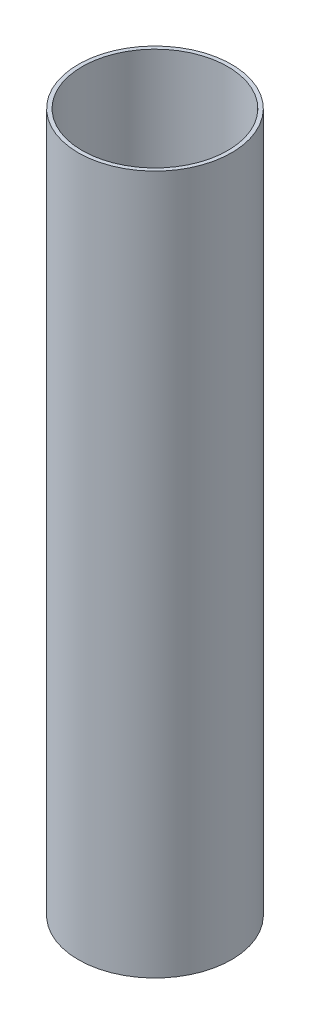
ISO-10303-21;
HEADER;
FILE_DESCRIPTION(('STEP AP214'),'2;1');
FILE_NAME('part.step','',(''),(''),'','','');
FILE_SCHEMA(('AUTOMOTIVE_DESIGN { 1 0 10303 214 1 1 1 1 }'));
ENDSEC;
DATA;
#1=APPLICATION_CONTEXT('core data for automotive mechanical design processes');
#2=APPLICATION_PROTOCOL_DEFINITION('international standard','automotive_design',2000,#1);
#3=PRODUCT_CONTEXT('',#1,'mechanical');
#4=PRODUCT('Part','Part','',(#3));
#5=PRODUCT_RELATED_PRODUCT_CATEGORY('part','',(#4));
#6=PRODUCT_DEFINITION_FORMATION('','',#4);
#7=PRODUCT_DEFINITION_CONTEXT('part definition',#1,'design');
#8=PRODUCT_DEFINITION('design','',#6,#7);
#9=PRODUCT_DEFINITION_SHAPE('','',#8);
#10=(LENGTH_UNIT() NAMED_UNIT(*) SI_UNIT(.MILLI.,.METRE.));
#11=(NAMED_UNIT(*) PLANE_ANGLE_UNIT() SI_UNIT($,.RADIAN.));
#12=(NAMED_UNIT(*) SI_UNIT($,.STERADIAN.) SOLID_ANGLE_UNIT());
#13=UNCERTAINTY_MEASURE_WITH_UNIT(LENGTH_MEASURE(1.E-05),#10,'distance_accuracy_value','');
#14=(GEOMETRIC_REPRESENTATION_CONTEXT(3) GLOBAL_UNCERTAINTY_ASSIGNED_CONTEXT((#13)) GLOBAL_UNIT_ASSIGNED_CONTEXT((#10,
#11,#12)) REPRESENTATION_CONTEXT('',''));
#15=CARTESIAN_POINT('',(0.,0.,0.));
#16=DIRECTION('',(0.,0.,1.));
#17=DIRECTION('',(1.,0.,0.));
#18=AXIS2_PLACEMENT_3D('',#15,#16,#17);
#19=CARTESIAN_POINT('',(0.,300.,0.));
#20=DIRECTION('',(0.,1.,0.));
#21=DIRECTION('',(0.,0.,1.));
#22=AXIS2_PLACEMENT_3D('',#19,#20,#21);
#23=PLANE('',#22);
#24=CARTESIAN_POINT('',(0.,300.,0.));
#25=DIRECTION('',(0.,1.,0.));
#26=DIRECTION('',(0.,0.,1.));
#27=AXIS2_PLACEMENT_3D('',#24,#25,#26);
#28=CIRCLE('',#27,32.9);
#29=CARTESIAN_POINT('',(0.,300.,32.9));
#30=VERTEX_POINT('',#29);
#31=EDGE_CURVE('E10',#30,#30,#28,.T.);
#32=ORIENTED_EDGE('',*,*,#31,.T.);
#33=EDGE_LOOP('',(#32));
#34=FACE_BOUND('',#33,.T.);
#35=CARTESIAN_POINT('',(0.,300.,0.));
#36=DIRECTION('',(0.,1.,0.));
#37=DIRECTION('',(0.,0.,1.));
#38=AXIS2_PLACEMENT_3D('',#35,#36,#37);
#39=CIRCLE('',#38,31.25);
#40=CARTESIAN_POINT('',(0.,300.,31.25));
#41=VERTEX_POINT('',#40);
#42=EDGE_CURVE('E42',#41,#41,#39,.T.);
#43=ORIENTED_EDGE('',*,*,#42,.F.);
#44=EDGE_LOOP('',(#43));
#45=FACE_BOUND('',#44,.T.);
#46=ADVANCED_FACE('F31',(#34,#45),#23,.T.);
#47=CARTESIAN_POINT('',(0.,0.,0.));
#48=DIRECTION('',(0.,1.,0.));
#49=DIRECTION('',(0.,0.,1.));
#50=AXIS2_PLACEMENT_3D('',#47,#48,#49);
#51=PLANE('',#50);
#52=CARTESIAN_POINT('',(0.,0.,0.));
#53=DIRECTION('',(0.,1.,0.));
#54=DIRECTION('',(0.,0.,1.));
#55=AXIS2_PLACEMENT_3D('',#52,#53,#54);
#56=CIRCLE('',#55,32.9);
#57=CARTESIAN_POINT('',(0.,0.,32.9));
#58=VERTEX_POINT('',#57);
#59=EDGE_CURVE('E35',#58,#58,#56,.T.);
#60=ORIENTED_EDGE('',*,*,#59,.F.);
#61=EDGE_LOOP('',(#60));
#62=FACE_BOUND('',#61,.T.);
#63=CARTESIAN_POINT('',(0.,0.,0.));
#64=DIRECTION('',(0.,1.,0.));
#65=DIRECTION('',(0.,0.,1.));
#66=AXIS2_PLACEMENT_3D('',#63,#64,#65);
#67=CIRCLE('',#66,31.25);
#68=CARTESIAN_POINT('',(0.,0.,31.25));
#69=VERTEX_POINT('',#68);
#70=EDGE_CURVE('E44',#69,#69,#67,.T.);
#71=ORIENTED_EDGE('',*,*,#70,.T.);
#72=EDGE_LOOP('',(#71));
#73=FACE_BOUND('',#72,.T.);
#74=ADVANCED_FACE('F54',(#62,#73),#51,.F.);
#75=CARTESIAN_POINT('',(0.,300.,0.));
#76=DIRECTION('',(0.,-1.,0.));
#77=DIRECTION('',(0.,0.,-1.));
#78=AXIS2_PLACEMENT_3D('',#75,#76,#77);
#79=CYLINDRICAL_SURFACE('',#78,32.9);
#80=ORIENTED_EDGE('',*,*,#31,.F.);
#81=EDGE_LOOP('',(#80));
#82=FACE_BOUND('',#81,.T.);
#83=ORIENTED_EDGE('',*,*,#59,.T.);
#84=EDGE_LOOP('',(#83));
#85=FACE_BOUND('',#84,.T.);
#86=ADVANCED_FACE('F33',(#82,#85),#79,.T.);
#87=CARTESIAN_POINT('',(0.,300.,0.));
#88=DIRECTION('',(0.,-1.,0.));
#89=DIRECTION('',(0.,0.,-1.));
#90=AXIS2_PLACEMENT_3D('',#87,#88,#89);
#91=CYLINDRICAL_SURFACE('',#90,31.25);
#92=ORIENTED_EDGE('',*,*,#42,.T.);
#93=EDGE_LOOP('',(#92));
#94=FACE_BOUND('',#93,.T.);
#95=ORIENTED_EDGE('',*,*,#70,.F.);
#96=EDGE_LOOP('',(#95));
#97=FACE_BOUND('',#96,.T.);
#98=ADVANCED_FACE('F50',(#94,#97),#91,.F.);
#99=CLOSED_SHELL('',(#46,#74,#86,#98));
#100=MANIFOLD_SOLID_BREP('B2',#99);
#101=ADVANCED_BREP_SHAPE_REPRESENTATION('',(#18,#100),#14);
#102=SHAPE_DEFINITION_REPRESENTATION(#9,#101);
ENDSEC;
END-ISO-10303-21;
